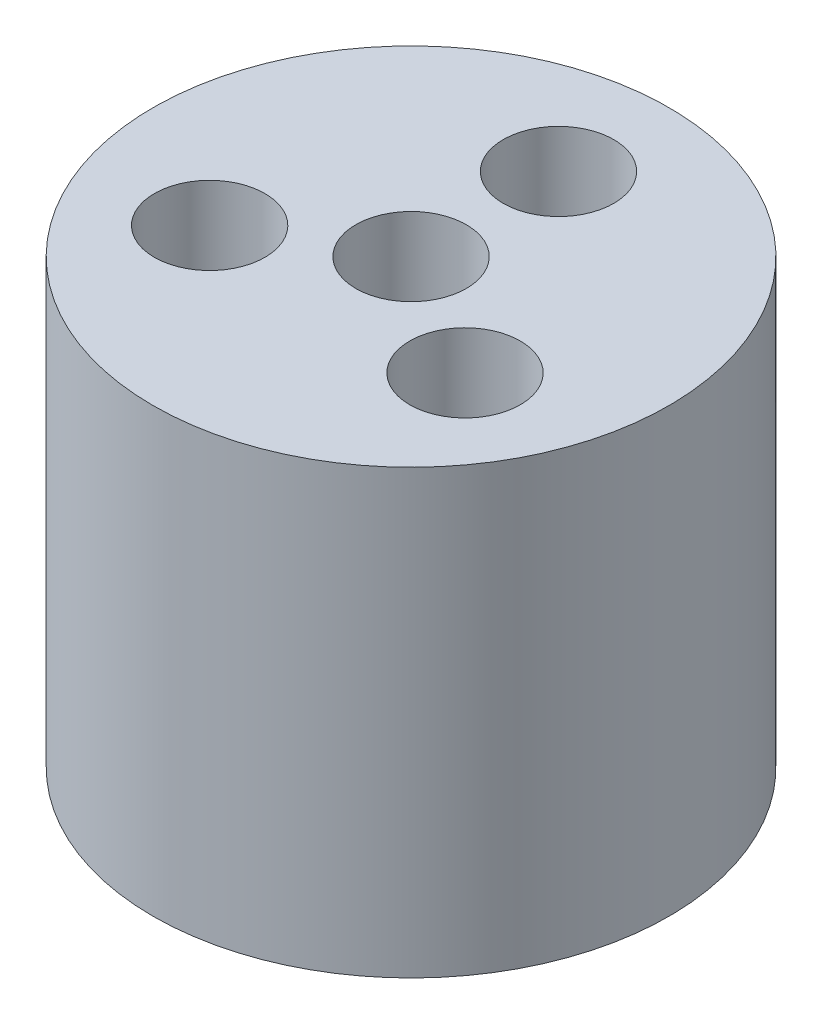
ISO-10303-21;
HEADER;
FILE_DESCRIPTION(('STEP AP214'),'2;1');
FILE_NAME('part.step','',(''),(''),'','','');
FILE_SCHEMA(('AUTOMOTIVE_DESIGN { 1 0 10303 214 1 1 1 1 }'));
ENDSEC;
DATA;
#1=APPLICATION_CONTEXT('core data for automotive mechanical design processes');
#2=APPLICATION_PROTOCOL_DEFINITION('international standard','automotive_design',2000,#1);
#3=PRODUCT_CONTEXT('',#1,'mechanical');
#4=PRODUCT('Part','Part','',(#3));
#5=PRODUCT_RELATED_PRODUCT_CATEGORY('part','',(#4));
#6=PRODUCT_DEFINITION_FORMATION('','',#4);
#7=PRODUCT_DEFINITION_CONTEXT('part definition',#1,'design');
#8=PRODUCT_DEFINITION('design','',#6,#7);
#9=PRODUCT_DEFINITION_SHAPE('','',#8);
#10=(LENGTH_UNIT() NAMED_UNIT(*) SI_UNIT(.MILLI.,.METRE.));
#11=(NAMED_UNIT(*) PLANE_ANGLE_UNIT() SI_UNIT($,.RADIAN.));
#12=(NAMED_UNIT(*) SI_UNIT($,.STERADIAN.) SOLID_ANGLE_UNIT());
#13=UNCERTAINTY_MEASURE_WITH_UNIT(LENGTH_MEASURE(1.E-05),#10,'distance_accuracy_value','');
#14=(GEOMETRIC_REPRESENTATION_CONTEXT(3) GLOBAL_UNCERTAINTY_ASSIGNED_CONTEXT((#13)) GLOBAL_UNIT_ASSIGNED_CONTEXT((#10,
#11,#12)) REPRESENTATION_CONTEXT('',''));
#15=CARTESIAN_POINT('',(0.,0.,0.));
#16=DIRECTION('',(0.,0.,1.));
#17=DIRECTION('',(1.,0.,0.));
#18=AXIS2_PLACEMENT_3D('',#15,#16,#17);
#19=CARTESIAN_POINT('',(0.,24.,0.));
#20=DIRECTION('',(0.,-1.,0.));
#21=DIRECTION('',(0.,0.,-1.));
#22=AXIS2_PLACEMENT_3D('',#19,#20,#21);
#23=CYLINDRICAL_SURFACE('',#22,14.);
#24=CARTESIAN_POINT('',(0.,24.,0.));
#25=DIRECTION('',(0.,1.,0.));
#26=DIRECTION('',(0.,0.,1.));
#27=AXIS2_PLACEMENT_3D('',#24,#25,#26);
#28=CIRCLE('',#27,14.);
#29=CARTESIAN_POINT('',(0.,24.,14.));
#30=VERTEX_POINT('',#29);
#31=EDGE_CURVE('E10',#30,#30,#28,.T.);
#32=ORIENTED_EDGE('',*,*,#31,.F.);
#33=EDGE_LOOP('',(#32));
#34=FACE_BOUND('',#33,.T.);
#35=CARTESIAN_POINT('',(0.,0.,0.));
#36=DIRECTION('',(0.,1.,0.));
#37=DIRECTION('',(0.,0.,1.));
#38=AXIS2_PLACEMENT_3D('',#35,#36,#37);
#39=CIRCLE('',#38,14.);
#40=CARTESIAN_POINT('',(0.,0.,14.));
#41=VERTEX_POINT('',#40);
#42=EDGE_CURVE('E34',#41,#41,#39,.T.);
#43=ORIENTED_EDGE('',*,*,#42,.T.);
#44=EDGE_LOOP('',(#43));
#45=FACE_BOUND('',#44,.T.);
#46=ADVANCED_FACE('F31',(#34,#45),#23,.T.);
#47=CARTESIAN_POINT('',(0.,24.,0.));
#48=DIRECTION('',(0.,1.,0.));
#49=DIRECTION('',(0.,0.,1.));
#50=AXIS2_PLACEMENT_3D('',#47,#48,#49);
#51=PLANE('',#50);
#52=CARTESIAN_POINT('',(0.,24.,-8.));
#53=DIRECTION('',(0.,1.,0.));
#54=DIRECTION('',(0.,0.,1.));
#55=AXIS2_PLACEMENT_3D('',#52,#53,#54);
#56=CIRCLE('',#55,3.);
#57=CARTESIAN_POINT('',(0.,24.,-5.));
#58=VERTEX_POINT('',#57);
#59=EDGE_CURVE('E61',#58,#58,#56,.T.);
#60=ORIENTED_EDGE('',*,*,#59,.F.);
#61=EDGE_LOOP('',(#60));
#62=FACE_BOUND('',#61,.T.);
#63=CARTESIAN_POINT('',(-6.928203230275,24.,4.0000000000003));
#64=DIRECTION('',(0.,1.,0.));
#65=DIRECTION('',(0.,0.,1.));
#66=AXIS2_PLACEMENT_3D('',#63,#64,#65);
#67=CIRCLE('',#66,3.00000000000065);
#68=CARTESIAN_POINT('',(-6.928203230275,24.,7.00000000000095));
#69=VERTEX_POINT('',#68);
#70=EDGE_CURVE('E55',#69,#69,#67,.T.);
#71=ORIENTED_EDGE('',*,*,#70,.F.);
#72=EDGE_LOOP('',(#71));
#73=FACE_BOUND('',#72,.T.);
#74=CARTESIAN_POINT('',(0.,24.,0.));
#75=DIRECTION('',(0.,1.,0.));
#76=DIRECTION('',(0.,0.,1.));
#77=AXIS2_PLACEMENT_3D('',#74,#75,#76);
#78=CIRCLE('',#77,3.);
#79=CARTESIAN_POINT('',(0.,24.,3.));
#80=VERTEX_POINT('',#79);
#81=EDGE_CURVE('E49',#80,#80,#78,.T.);
#82=ORIENTED_EDGE('',*,*,#81,.F.);
#83=EDGE_LOOP('',(#82));
#84=FACE_BOUND('',#83,.T.);
#85=CARTESIAN_POINT('',(6.92820323027602,24.,3.99999999999971));
#86=DIRECTION('',(0.,1.,0.));
#87=DIRECTION('',(0.,0.,1.));
#88=AXIS2_PLACEMENT_3D('',#85,#86,#87);
#89=CIRCLE('',#88,3.00000000000044);
#90=CARTESIAN_POINT('',(6.92820323027602,24.,7.00000000000014));
#91=VERTEX_POINT('',#90);
#92=EDGE_CURVE('E43',#91,#91,#89,.T.);
#93=ORIENTED_EDGE('',*,*,#92,.F.);
#94=EDGE_LOOP('',(#93));
#95=FACE_BOUND('',#94,.T.);
#96=ORIENTED_EDGE('',*,*,#31,.T.);
#97=EDGE_LOOP('',(#96));
#98=FACE_BOUND('',#97,.T.);
#99=ADVANCED_FACE('F77',(#62,#73,#84,#95,#98),#51,.T.);
#100=CARTESIAN_POINT('',(0.,0.,0.));
#101=DIRECTION('',(0.,1.,0.));
#102=DIRECTION('',(0.,0.,1.));
#103=AXIS2_PLACEMENT_3D('',#100,#101,#102);
#104=PLANE('',#103);
#105=CARTESIAN_POINT('',(0.,0.,-8.));
#106=DIRECTION('',(0.,1.,0.));
#107=DIRECTION('',(0.,0.,1.));
#108=AXIS2_PLACEMENT_3D('',#105,#106,#107);
#109=CIRCLE('',#108,3.);
#110=CARTESIAN_POINT('',(0.,0.,-5.));
#111=VERTEX_POINT('',#110);
#112=EDGE_CURVE('E41',#111,#111,#109,.T.);
#113=ORIENTED_EDGE('',*,*,#112,.T.);
#114=EDGE_LOOP('',(#113));
#115=FACE_BOUND('',#114,.T.);
#116=CARTESIAN_POINT('',(-6.928203230275,0.,4.0000000000003));
#117=DIRECTION('',(0.,1.,0.));
#118=DIRECTION('',(0.,0.,1.));
#119=AXIS2_PLACEMENT_3D('',#116,#117,#118);
#120=CIRCLE('',#119,3.00000000000065);
#121=CARTESIAN_POINT('',(-6.928203230275,0.,7.00000000000095));
#122=VERTEX_POINT('',#121);
#123=EDGE_CURVE('E58',#122,#122,#120,.T.);
#124=ORIENTED_EDGE('',*,*,#123,.T.);
#125=EDGE_LOOP('',(#124));
#126=FACE_BOUND('',#125,.T.);
#127=CARTESIAN_POINT('',(0.,0.,0.));
#128=DIRECTION('',(0.,1.,0.));
#129=DIRECTION('',(0.,0.,1.));
#130=AXIS2_PLACEMENT_3D('',#127,#128,#129);
#131=CIRCLE('',#130,3.);
#132=CARTESIAN_POINT('',(0.,0.,3.));
#133=VERTEX_POINT('',#132);
#134=EDGE_CURVE('E52',#133,#133,#131,.T.);
#135=ORIENTED_EDGE('',*,*,#134,.T.);
#136=EDGE_LOOP('',(#135));
#137=FACE_BOUND('',#136,.T.);
#138=CARTESIAN_POINT('',(6.92820323027602,0.,3.99999999999971));
#139=DIRECTION('',(0.,1.,0.));
#140=DIRECTION('',(0.,0.,1.));
#141=AXIS2_PLACEMENT_3D('',#138,#139,#140);
#142=CIRCLE('',#141,3.00000000000044);
#143=CARTESIAN_POINT('',(6.92820323027602,0.,7.00000000000014));
#144=VERTEX_POINT('',#143);
#145=EDGE_CURVE('E46',#144,#144,#142,.T.);
#146=ORIENTED_EDGE('',*,*,#145,.T.);
#147=EDGE_LOOP('',(#146));
#148=FACE_BOUND('',#147,.T.);
#149=ORIENTED_EDGE('',*,*,#42,.F.);
#150=EDGE_LOOP('',(#149));
#151=FACE_BOUND('',#150,.T.);
#152=ADVANCED_FACE('F67',(#115,#126,#137,#148,#151),#104,.F.);
#153=CARTESIAN_POINT('',(6.92820323027602,0.,3.99999999999971));
#154=DIRECTION('',(0.,1.,0.));
#155=DIRECTION('',(0.,0.,1.));
#156=AXIS2_PLACEMENT_3D('',#153,#154,#155);
#157=CYLINDRICAL_SURFACE('',#156,3.00000000000044);
#158=ORIENTED_EDGE('',*,*,#145,.F.);
#159=EDGE_LOOP('',(#158));
#160=FACE_BOUND('',#159,.T.);
#161=ORIENTED_EDGE('',*,*,#92,.T.);
#162=EDGE_LOOP('',(#161));
#163=FACE_BOUND('',#162,.T.);
#164=ADVANCED_FACE('F87',(#160,#163),#157,.F.);
#165=CARTESIAN_POINT('',(0.,0.,0.));
#166=DIRECTION('',(0.,1.,0.));
#167=DIRECTION('',(0.,0.,1.));
#168=AXIS2_PLACEMENT_3D('',#165,#166,#167);
#169=CYLINDRICAL_SURFACE('',#168,3.);
#170=ORIENTED_EDGE('',*,*,#134,.F.);
#171=EDGE_LOOP('',(#170));
#172=FACE_BOUND('',#171,.T.);
#173=ORIENTED_EDGE('',*,*,#81,.T.);
#174=EDGE_LOOP('',(#173));
#175=FACE_BOUND('',#174,.T.);
#176=ADVANCED_FACE('F89',(#172,#175),#169,.F.);
#177=CARTESIAN_POINT('',(-6.928203230275,0.,4.0000000000003));
#178=DIRECTION('',(0.,1.,0.));
#179=DIRECTION('',(0.,0.,1.));
#180=AXIS2_PLACEMENT_3D('',#177,#178,#179);
#181=CYLINDRICAL_SURFACE('',#180,3.00000000000065);
#182=ORIENTED_EDGE('',*,*,#123,.F.);
#183=EDGE_LOOP('',(#182));
#184=FACE_BOUND('',#183,.T.);
#185=ORIENTED_EDGE('',*,*,#70,.T.);
#186=EDGE_LOOP('',(#185));
#187=FACE_BOUND('',#186,.T.);
#188=ADVANCED_FACE('F73',(#184,#187),#181,.F.);
#189=CARTESIAN_POINT('',(0.,0.,-8.));
#190=DIRECTION('',(0.,1.,0.));
#191=DIRECTION('',(0.,0.,1.));
#192=AXIS2_PLACEMENT_3D('',#189,#190,#191);
#193=CYLINDRICAL_SURFACE('',#192,3.);
#194=ORIENTED_EDGE('',*,*,#112,.F.);
#195=EDGE_LOOP('',(#194));
#196=FACE_BOUND('',#195,.T.);
#197=ORIENTED_EDGE('',*,*,#59,.T.);
#198=EDGE_LOOP('',(#197));
#199=FACE_BOUND('',#198,.T.);
#200=ADVANCED_FACE('F70',(#196,#199),#193,.F.);
#201=CLOSED_SHELL('',(#46,#99,#152,#164,#176,#188,#200));
#202=MANIFOLD_SOLID_BREP('B2',#201);
#203=ADVANCED_BREP_SHAPE_REPRESENTATION('',(#18,#202),#14);
#204=SHAPE_DEFINITION_REPRESENTATION(#9,#203);
ENDSEC;
END-ISO-10303-21;
